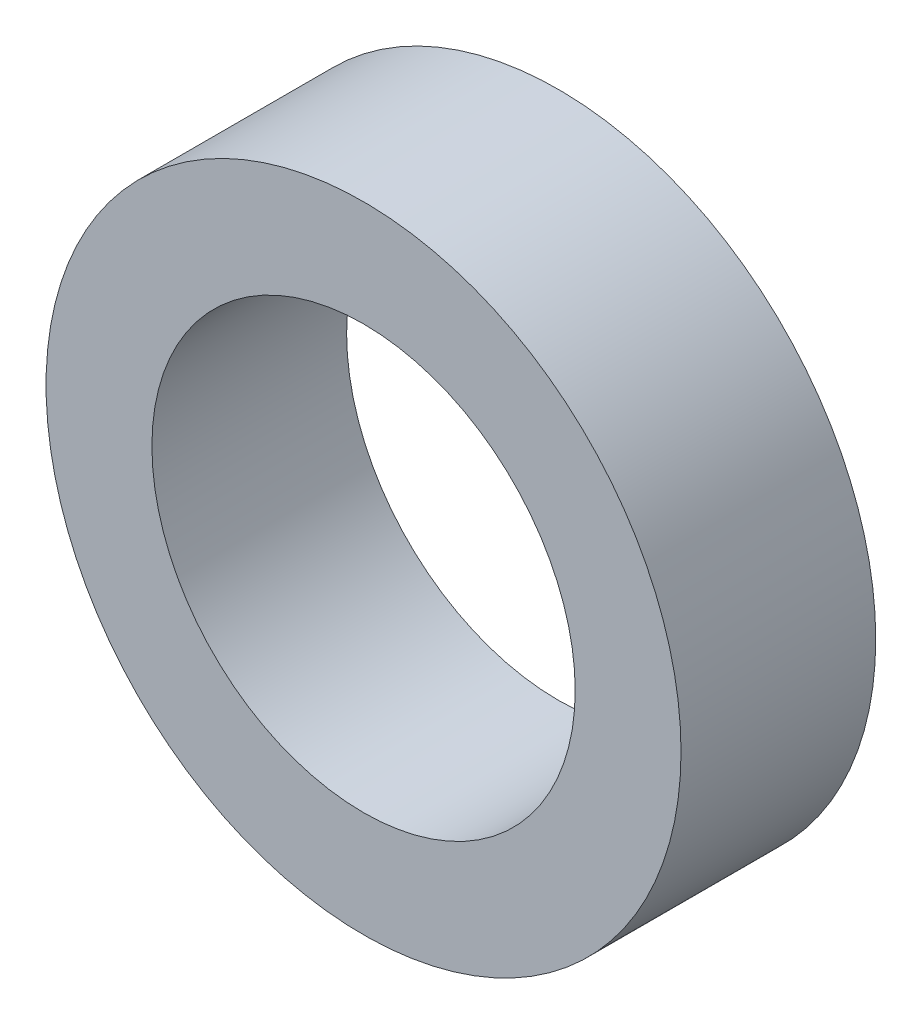
ISO-10303-21;
HEADER;
FILE_DESCRIPTION(('STEP AP214'),'2;1');
FILE_NAME('part.step','',(''),(''),'','','');
FILE_SCHEMA(('AUTOMOTIVE_DESIGN { 1 0 10303 214 1 1 1 1 }'));
ENDSEC;
DATA;
#1=APPLICATION_CONTEXT('core data for automotive mechanical design processes');
#2=APPLICATION_PROTOCOL_DEFINITION('international standard','automotive_design',2000,#1);
#3=PRODUCT_CONTEXT('',#1,'mechanical');
#4=PRODUCT('Part','Part','',(#3));
#5=PRODUCT_RELATED_PRODUCT_CATEGORY('part','',(#4));
#6=PRODUCT_DEFINITION_FORMATION('','',#4);
#7=PRODUCT_DEFINITION_CONTEXT('part definition',#1,'design');
#8=PRODUCT_DEFINITION('design','',#6,#7);
#9=PRODUCT_DEFINITION_SHAPE('','',#8);
#10=(LENGTH_UNIT() NAMED_UNIT(*) SI_UNIT(.MILLI.,.METRE.));
#11=(NAMED_UNIT(*) PLANE_ANGLE_UNIT() SI_UNIT($,.RADIAN.));
#12=(NAMED_UNIT(*) SI_UNIT($,.STERADIAN.) SOLID_ANGLE_UNIT());
#13=UNCERTAINTY_MEASURE_WITH_UNIT(LENGTH_MEASURE(1.E-05),#10,'distance_accuracy_value','');
#14=(GEOMETRIC_REPRESENTATION_CONTEXT(3) GLOBAL_UNCERTAINTY_ASSIGNED_CONTEXT((#13)) GLOBAL_UNIT_ASSIGNED_CONTEXT((#10,
#11,#12)) REPRESENTATION_CONTEXT('',''));
#15=CARTESIAN_POINT('',(0.,0.,0.));
#16=DIRECTION('',(0.,0.,1.));
#17=DIRECTION('',(1.,0.,0.));
#18=AXIS2_PLACEMENT_3D('',#15,#16,#17);
#19=CARTESIAN_POINT('',(0.,0.,23.));
#20=DIRECTION('',(0.,0.,1.));
#21=DIRECTION('',(1.,0.,0.));
#22=AXIS2_PLACEMENT_3D('',#19,#20,#21);
#23=PLANE('',#22);
#24=CARTESIAN_POINT('',(0.,0.,23.));
#25=DIRECTION('',(0.,0.,1.));
#26=DIRECTION('',(1.,0.,0.));
#27=AXIS2_PLACEMENT_3D('',#24,#25,#26);
#28=CIRCLE('',#27,37.5);
#29=CARTESIAN_POINT('',(37.5,0.,23.));
#30=VERTEX_POINT('',#29);
#31=EDGE_CURVE('E10',#30,#30,#28,.T.);
#32=ORIENTED_EDGE('',*,*,#31,.T.);
#33=EDGE_LOOP('',(#32));
#34=FACE_BOUND('',#33,.T.);
#35=CARTESIAN_POINT('',(0.,0.,23.));
#36=DIRECTION('',(0.,0.,1.));
#37=DIRECTION('',(1.,0.,0.));
#38=AXIS2_PLACEMENT_3D('',#35,#36,#37);
#39=CIRCLE('',#38,25.);
#40=CARTESIAN_POINT('',(25.,0.,23.));
#41=VERTEX_POINT('',#40);
#42=EDGE_CURVE('E50',#41,#41,#39,.T.);
#43=ORIENTED_EDGE('',*,*,#42,.F.);
#44=EDGE_LOOP('',(#43));
#45=FACE_BOUND('',#44,.T.);
#46=ADVANCED_FACE('F37',(#34,#45),#23,.T.);
#47=CARTESIAN_POINT('',(0.,0.,0.));
#48=DIRECTION('',(0.,0.,1.));
#49=DIRECTION('',(1.,0.,0.));
#50=AXIS2_PLACEMENT_3D('',#47,#48,#49);
#51=PLANE('',#50);
#52=CARTESIAN_POINT('',(0.,0.,0.));
#53=DIRECTION('',(0.,0.,1.));
#54=DIRECTION('',(1.,0.,0.));
#55=AXIS2_PLACEMENT_3D('',#52,#53,#54);
#56=CIRCLE('',#55,37.5);
#57=CARTESIAN_POINT('',(37.5,0.,0.));
#58=VERTEX_POINT('',#57);
#59=EDGE_CURVE('E41',#58,#58,#56,.T.);
#60=ORIENTED_EDGE('',*,*,#59,.F.);
#61=EDGE_LOOP('',(#60));
#62=FACE_BOUND('',#61,.T.);
#63=CARTESIAN_POINT('',(0.,0.,0.));
#64=DIRECTION('',(0.,0.,1.));
#65=DIRECTION('',(1.,0.,0.));
#66=AXIS2_PLACEMENT_3D('',#63,#64,#65);
#67=CIRCLE('',#66,25.);
#68=CARTESIAN_POINT('',(25.,0.,0.));
#69=VERTEX_POINT('',#68);
#70=EDGE_CURVE('E52',#69,#69,#67,.T.);
#71=ORIENTED_EDGE('',*,*,#70,.T.);
#72=EDGE_LOOP('',(#71));
#73=FACE_BOUND('',#72,.T.);
#74=ADVANCED_FACE('F64',(#62,#73),#51,.F.);
#75=CARTESIAN_POINT('',(0.,0.,23.));
#76=DIRECTION('',(0.,0.,-1.));
#77=DIRECTION('',(-1.,0.,0.));
#78=AXIS2_PLACEMENT_3D('',#75,#76,#77);
#79=CYLINDRICAL_SURFACE('',#78,37.5);
#80=ORIENTED_EDGE('',*,*,#31,.F.);
#81=EDGE_LOOP('',(#80));
#82=FACE_BOUND('',#81,.T.);
#83=ORIENTED_EDGE('',*,*,#59,.T.);
#84=EDGE_LOOP('',(#83));
#85=FACE_BOUND('',#84,.T.);
#86=ADVANCED_FACE('F39',(#82,#85),#79,.T.);
#87=CARTESIAN_POINT('',(0.,0.,23.));
#88=DIRECTION('',(0.,0.,-1.));
#89=DIRECTION('',(-1.,0.,0.));
#90=AXIS2_PLACEMENT_3D('',#87,#88,#89);
#91=CYLINDRICAL_SURFACE('',#90,25.);
#92=ORIENTED_EDGE('',*,*,#42,.T.);
#93=EDGE_LOOP('',(#92));
#94=FACE_BOUND('',#93,.T.);
#95=ORIENTED_EDGE('',*,*,#70,.F.);
#96=EDGE_LOOP('',(#95));
#97=FACE_BOUND('',#96,.T.);
#98=ADVANCED_FACE('F60',(#94,#97),#91,.F.);
#99=CLOSED_SHELL('',(#46,#74,#86,#98));
#100=MANIFOLD_SOLID_BREP('B2',#99);
#101=ADVANCED_BREP_SHAPE_REPRESENTATION('',(#18,#100),#14);
#102=SHAPE_DEFINITION_REPRESENTATION(#9,#101);
ENDSEC;
END-ISO-10303-21;
